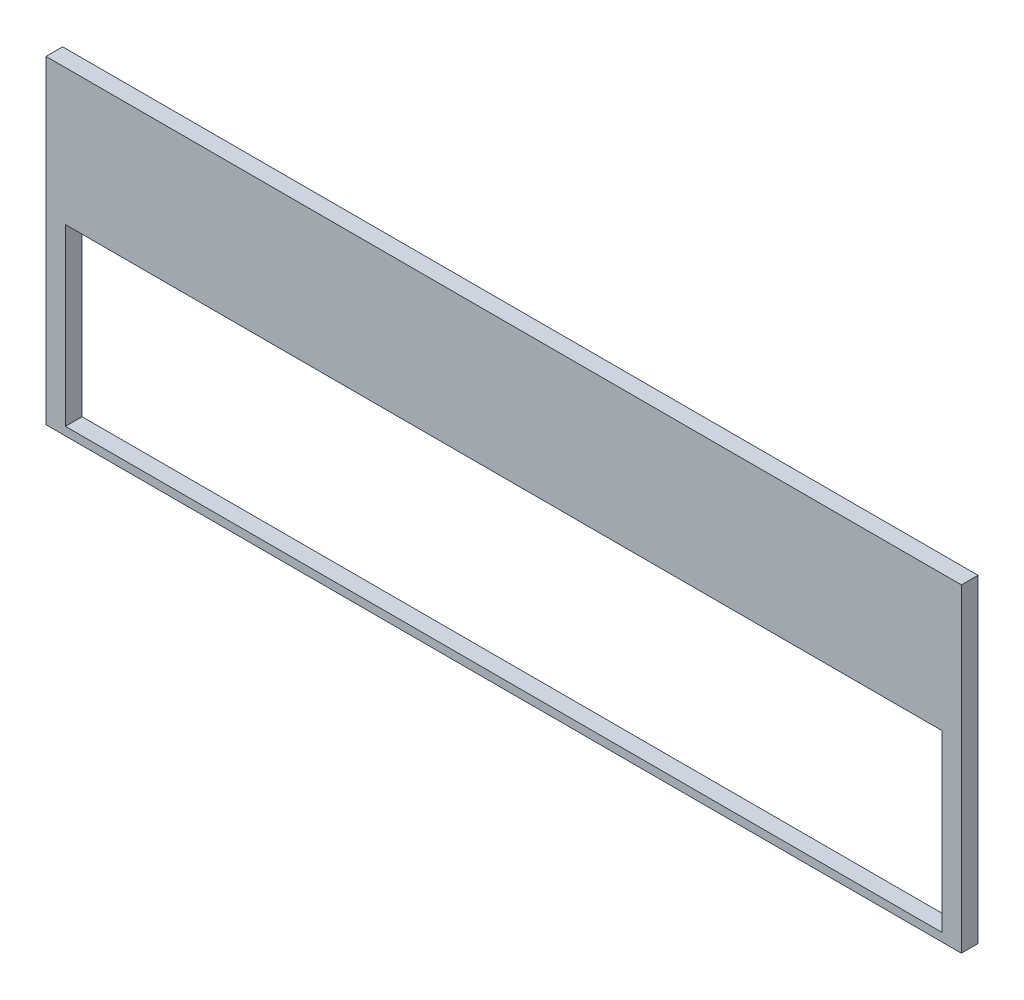
ISO-10303-21;
HEADER;
FILE_DESCRIPTION(('STEP AP214'),'2;1');
FILE_NAME('part.step','',(''),(''),'','','');
FILE_SCHEMA(('AUTOMOTIVE_DESIGN { 1 0 10303 214 1 1 1 1 }'));
ENDSEC;
DATA;
#1=APPLICATION_CONTEXT('core data for automotive mechanical design processes');
#2=APPLICATION_PROTOCOL_DEFINITION('international standard','automotive_design',2000,#1);
#3=PRODUCT_CONTEXT('',#1,'mechanical');
#4=PRODUCT('Part','Part','',(#3));
#5=PRODUCT_RELATED_PRODUCT_CATEGORY('part','',(#4));
#6=PRODUCT_DEFINITION_FORMATION('','',#4);
#7=PRODUCT_DEFINITION_CONTEXT('part definition',#1,'design');
#8=PRODUCT_DEFINITION('design','',#6,#7);
#9=PRODUCT_DEFINITION_SHAPE('','',#8);
#10=(LENGTH_UNIT() NAMED_UNIT(*) SI_UNIT(.MILLI.,.METRE.));
#11=(NAMED_UNIT(*) PLANE_ANGLE_UNIT() SI_UNIT($,.RADIAN.));
#12=(NAMED_UNIT(*) SI_UNIT($,.STERADIAN.) SOLID_ANGLE_UNIT());
#13=UNCERTAINTY_MEASURE_WITH_UNIT(LENGTH_MEASURE(1.E-05),#10,'distance_accuracy_value','');
#14=(GEOMETRIC_REPRESENTATION_CONTEXT(3) GLOBAL_UNCERTAINTY_ASSIGNED_CONTEXT((#13)) GLOBAL_UNIT_ASSIGNED_CONTEXT((#10,
#11,#12)) REPRESENTATION_CONTEXT('',''));
#15=CARTESIAN_POINT('',(0.,0.,0.));
#16=DIRECTION('',(0.,0.,1.));
#17=DIRECTION('',(1.,0.,0.));
#18=AXIS2_PLACEMENT_3D('',#15,#16,#17);
#19=CARTESIAN_POINT('',(-165.,-57.5,6.));
#20=DIRECTION('',(1.,0.,0.));
#21=DIRECTION('',(0.,0.,-1.));
#22=AXIS2_PLACEMENT_3D('',#19,#20,#21);
#23=PLANE('',#22);
#24=DIRECTION('',(0.,-1.,0.));
#25=VECTOR('',#24,1.);
#26=CARTESIAN_POINT('',(-165.,-57.5,0.));
#27=LINE('',#26,#25);
#28=CARTESIAN_POINT('',(-165.,57.5,0.));
#29=VERTEX_POINT('',#28);
#30=CARTESIAN_POINT('',(-165.,-57.5,0.));
#31=VERTEX_POINT('',#30);
#32=EDGE_CURVE('E130',#29,#31,#27,.T.);
#33=ORIENTED_EDGE('',*,*,#32,.T.);
#34=DIRECTION('',(0.,0.,-1.));
#35=VECTOR('',#34,1.);
#36=CARTESIAN_POINT('',(-165.,-57.5,6.));
#37=LINE('',#36,#35);
#38=CARTESIAN_POINT('',(-165.,-57.5,6.));
#39=VERTEX_POINT('',#38);
#40=EDGE_CURVE('E11',#39,#31,#37,.T.);
#41=ORIENTED_EDGE('',*,*,#40,.F.);
#42=DIRECTION('',(0.,-1.,0.));
#43=VECTOR('',#42,1.);
#44=CARTESIAN_POINT('',(-165.,-57.5,6.));
#45=LINE('',#44,#43);
#46=CARTESIAN_POINT('',(-165.,57.5,6.));
#47=VERTEX_POINT('',#46);
#48=EDGE_CURVE('E134',#47,#39,#45,.T.);
#49=ORIENTED_EDGE('',*,*,#48,.F.);
#50=DIRECTION('',(0.,0.,-1.));
#51=VECTOR('',#50,1.);
#52=CARTESIAN_POINT('',(-165.,57.5,6.));
#53=LINE('',#52,#51);
#54=EDGE_CURVE('E144',#47,#29,#53,.T.);
#55=ORIENTED_EDGE('',*,*,#54,.T.);
#56=EDGE_LOOP('',(#33,#41,#49,#55));
#57=FACE_BOUND('',#56,.T.);
#58=ADVANCED_FACE('F33',(#57),#23,.F.);
#59=CARTESIAN_POINT('',(165.,-57.5,6.));
#60=DIRECTION('',(0.,1.,0.));
#61=DIRECTION('',(-1.,0.,0.));
#62=AXIS2_PLACEMENT_3D('',#59,#60,#61);
#63=PLANE('',#62);
#64=DIRECTION('',(1.,0.,0.));
#65=VECTOR('',#64,1.);
#66=CARTESIAN_POINT('',(165.,-57.5,0.));
#67=LINE('',#66,#65);
#68=CARTESIAN_POINT('',(165.,-57.5,0.));
#69=VERTEX_POINT('',#68);
#70=EDGE_CURVE('E147',#31,#69,#67,.T.);
#71=ORIENTED_EDGE('',*,*,#70,.T.);
#72=DIRECTION('',(0.,0.,-1.));
#73=VECTOR('',#72,1.);
#74=CARTESIAN_POINT('',(165.,-57.5,6.));
#75=LINE('',#74,#73);
#76=CARTESIAN_POINT('',(165.,-57.5,6.));
#77=VERTEX_POINT('',#76);
#78=EDGE_CURVE('E40',#77,#69,#75,.T.);
#79=ORIENTED_EDGE('',*,*,#78,.F.);
#80=DIRECTION('',(1.,0.,0.));
#81=VECTOR('',#80,1.);
#82=CARTESIAN_POINT('',(165.,-57.5,6.));
#83=LINE('',#82,#81);
#84=EDGE_CURVE('E137',#39,#77,#83,.T.);
#85=ORIENTED_EDGE('',*,*,#84,.F.);
#86=ORIENTED_EDGE('',*,*,#40,.T.);
#87=EDGE_LOOP('',(#71,#79,#85,#86));
#88=FACE_BOUND('',#87,.T.);
#89=ADVANCED_FACE('F175',(#88),#63,.F.);
#90=CARTESIAN_POINT('',(165.,-57.5,6.));
#91=DIRECTION('',(-1.,0.,0.));
#92=DIRECTION('',(0.,0.,1.));
#93=AXIS2_PLACEMENT_3D('',#90,#91,#92);
#94=PLANE('',#93);
#95=DIRECTION('',(0.,1.,0.));
#96=VECTOR('',#95,1.);
#97=CARTESIAN_POINT('',(165.,-57.5,0.));
#98=LINE('',#97,#96);
#99=CARTESIAN_POINT('',(165.,57.5,0.));
#100=VERTEX_POINT('',#99);
#101=EDGE_CURVE('E149',#69,#100,#98,.T.);
#102=ORIENTED_EDGE('',*,*,#101,.T.);
#103=DIRECTION('',(0.,0.,-1.));
#104=VECTOR('',#103,1.);
#105=CARTESIAN_POINT('',(165.,57.5,6.));
#106=LINE('',#105,#104);
#107=CARTESIAN_POINT('',(165.,57.5,6.));
#108=VERTEX_POINT('',#107);
#109=EDGE_CURVE('E154',#108,#100,#106,.T.);
#110=ORIENTED_EDGE('',*,*,#109,.F.);
#111=DIRECTION('',(0.,1.,0.));
#112=VECTOR('',#111,1.);
#113=CARTESIAN_POINT('',(165.,-57.5,6.));
#114=LINE('',#113,#112);
#115=EDGE_CURVE('E140',#77,#108,#114,.T.);
#116=ORIENTED_EDGE('',*,*,#115,.F.);
#117=ORIENTED_EDGE('',*,*,#78,.T.);
#118=EDGE_LOOP('',(#102,#110,#116,#117));
#119=FACE_BOUND('',#118,.T.);
#120=ADVANCED_FACE('F161',(#119),#94,.F.);
#121=CARTESIAN_POINT('',(165.,57.5,6.));
#122=DIRECTION('',(0.,-1.,0.));
#123=DIRECTION('',(1.,0.,0.));
#124=AXIS2_PLACEMENT_3D('',#121,#122,#123);
#125=PLANE('',#124);
#126=DIRECTION('',(-1.,0.,0.));
#127=VECTOR('',#126,1.);
#128=CARTESIAN_POINT('',(165.,57.5,0.));
#129=LINE('',#128,#127);
#130=EDGE_CURVE('E138',#100,#29,#129,.T.);
#131=ORIENTED_EDGE('',*,*,#130,.T.);
#132=ORIENTED_EDGE('',*,*,#54,.F.);
#133=DIRECTION('',(-1.,0.,0.));
#134=VECTOR('',#133,1.);
#135=CARTESIAN_POINT('',(165.,57.5,6.));
#136=LINE('',#135,#134);
#137=EDGE_CURVE('E142',#108,#47,#136,.T.);
#138=ORIENTED_EDGE('',*,*,#137,.F.);
#139=ORIENTED_EDGE('',*,*,#109,.T.);
#140=EDGE_LOOP('',(#131,#132,#138,#139));
#141=FACE_BOUND('',#140,.T.);
#142=ADVANCED_FACE('F170',(#141),#125,.F.);
#143=CARTESIAN_POINT('',(0.,0.,6.));
#144=DIRECTION('',(0.,0.,1.));
#145=DIRECTION('',(1.,0.,0.));
#146=AXIS2_PLACEMENT_3D('',#143,#144,#145);
#147=PLANE('',#146);
#148=DIRECTION('',(0.,-1.,0.));
#149=VECTOR('',#148,1.);
#150=CARTESIAN_POINT('',(158.,-54.5,6.));
#151=LINE('',#150,#149);
#152=CARTESIAN_POINT('',(158.,8.49999999999997,6.));
#153=VERTEX_POINT('',#152);
#154=CARTESIAN_POINT('',(158.,-54.5,6.));
#155=VERTEX_POINT('',#154);
#156=EDGE_CURVE('E99',#153,#155,#151,.T.);
#157=ORIENTED_EDGE('',*,*,#156,.T.);
#158=DIRECTION('',(-1.,0.,0.));
#159=VECTOR('',#158,1.);
#160=CARTESIAN_POINT('',(158.,-54.5,6.));
#161=LINE('',#160,#159);
#162=CARTESIAN_POINT('',(-158.,-54.5,6.));
#163=VERTEX_POINT('',#162);
#164=EDGE_CURVE('E108',#155,#163,#161,.T.);
#165=ORIENTED_EDGE('',*,*,#164,.T.);
#166=DIRECTION('',(0.,1.,0.));
#167=VECTOR('',#166,1.);
#168=CARTESIAN_POINT('',(-158.,-54.5,6.));
#169=LINE('',#168,#167);
#170=CARTESIAN_POINT('',(-158.,8.49999999999997,6.));
#171=VERTEX_POINT('',#170);
#172=EDGE_CURVE('E47',#163,#171,#169,.T.);
#173=ORIENTED_EDGE('',*,*,#172,.T.);
#174=DIRECTION('',(1.,0.,0.));
#175=VECTOR('',#174,1.);
#176=CARTESIAN_POINT('',(158.,8.49999999999997,6.));
#177=LINE('',#176,#175);
#178=EDGE_CURVE('E105',#171,#153,#177,.T.);
#179=ORIENTED_EDGE('',*,*,#178,.T.);
#180=EDGE_LOOP('',(#157,#165,#173,#179));
#181=FACE_BOUND('',#180,.T.);
#182=ORIENTED_EDGE('',*,*,#48,.T.);
#183=ORIENTED_EDGE('',*,*,#84,.T.);
#184=ORIENTED_EDGE('',*,*,#115,.T.);
#185=ORIENTED_EDGE('',*,*,#137,.T.);
#186=EDGE_LOOP('',(#182,#183,#184,#185));
#187=FACE_BOUND('',#186,.T.);
#188=ADVANCED_FACE('F112',(#181,#187),#147,.T.);
#189=CARTESIAN_POINT('',(0.,0.,0.));
#190=DIRECTION('',(0.,0.,1.));
#191=DIRECTION('',(1.,0.,0.));
#192=AXIS2_PLACEMENT_3D('',#189,#190,#191);
#193=PLANE('',#192);
#194=DIRECTION('',(-1.,0.,0.));
#195=VECTOR('',#194,1.);
#196=CARTESIAN_POINT('',(158.,-54.5,0.));
#197=LINE('',#196,#195);
#198=CARTESIAN_POINT('',(158.,-54.5,0.));
#199=VERTEX_POINT('',#198);
#200=CARTESIAN_POINT('',(-158.,-54.5,0.));
#201=VERTEX_POINT('',#200);
#202=EDGE_CURVE('E124',#199,#201,#197,.T.);
#203=ORIENTED_EDGE('',*,*,#202,.F.);
#204=DIRECTION('',(0.,-1.,0.));
#205=VECTOR('',#204,1.);
#206=CARTESIAN_POINT('',(158.,-54.5,0.));
#207=LINE('',#206,#205);
#208=CARTESIAN_POINT('',(158.,8.49999999999997,0.));
#209=VERTEX_POINT('',#208);
#210=EDGE_CURVE('E55',#209,#199,#207,.T.);
#211=ORIENTED_EDGE('',*,*,#210,.F.);
#212=DIRECTION('',(1.,0.,0.));
#213=VECTOR('',#212,1.);
#214=CARTESIAN_POINT('',(158.,8.49999999999997,0.));
#215=LINE('',#214,#213);
#216=CARTESIAN_POINT('',(-158.,8.49999999999997,0.));
#217=VERTEX_POINT('',#216);
#218=EDGE_CURVE('E115',#217,#209,#215,.T.);
#219=ORIENTED_EDGE('',*,*,#218,.F.);
#220=DIRECTION('',(0.,1.,0.));
#221=VECTOR('',#220,1.);
#222=CARTESIAN_POINT('',(-158.,-54.5,0.));
#223=LINE('',#222,#221);
#224=EDGE_CURVE('E118',#201,#217,#223,.T.);
#225=ORIENTED_EDGE('',*,*,#224,.F.);
#226=EDGE_LOOP('',(#203,#211,#219,#225));
#227=FACE_BOUND('',#226,.T.);
#228=ORIENTED_EDGE('',*,*,#32,.F.);
#229=ORIENTED_EDGE('',*,*,#130,.F.);
#230=ORIENTED_EDGE('',*,*,#101,.F.);
#231=ORIENTED_EDGE('',*,*,#70,.F.);
#232=EDGE_LOOP('',(#228,#229,#230,#231));
#233=FACE_BOUND('',#232,.T.);
#234=ADVANCED_FACE('F167',(#227,#233),#193,.F.);
#235=CARTESIAN_POINT('',(158.,-54.5,6.));
#236=DIRECTION('',(1.,0.,0.));
#237=DIRECTION('',(0.,0.,-1.));
#238=AXIS2_PLACEMENT_3D('',#235,#236,#237);
#239=PLANE('',#238);
#240=ORIENTED_EDGE('',*,*,#210,.T.);
#241=DIRECTION('',(0.,0.,-1.));
#242=VECTOR('',#241,1.);
#243=CARTESIAN_POINT('',(158.,-54.5,6.));
#244=LINE('',#243,#242);
#245=EDGE_CURVE('E95',#155,#199,#244,.T.);
#246=ORIENTED_EDGE('',*,*,#245,.F.);
#247=ORIENTED_EDGE('',*,*,#156,.F.);
#248=DIRECTION('',(0.,0.,-1.));
#249=VECTOR('',#248,1.);
#250=CARTESIAN_POINT('',(158.,8.49999999999997,6.));
#251=LINE('',#250,#249);
#252=EDGE_CURVE('E128',#153,#209,#251,.T.);
#253=ORIENTED_EDGE('',*,*,#252,.T.);
#254=EDGE_LOOP('',(#240,#246,#247,#253));
#255=FACE_BOUND('',#254,.T.);
#256=ADVANCED_FACE('F97',(#255),#239,.F.);
#257=CARTESIAN_POINT('',(158.,8.49999999999997,6.));
#258=DIRECTION('',(0.,1.,0.));
#259=DIRECTION('',(0.,0.,1.));
#260=AXIS2_PLACEMENT_3D('',#257,#258,#259);
#261=PLANE('',#260);
#262=ORIENTED_EDGE('',*,*,#218,.T.);
#263=ORIENTED_EDGE('',*,*,#252,.F.);
#264=ORIENTED_EDGE('',*,*,#178,.F.);
#265=DIRECTION('',(0.,0.,-1.));
#266=VECTOR('',#265,1.);
#267=CARTESIAN_POINT('',(-158.,8.49999999999997,6.));
#268=LINE('',#267,#266);
#269=EDGE_CURVE('E131',#171,#217,#268,.T.);
#270=ORIENTED_EDGE('',*,*,#269,.T.);
#271=EDGE_LOOP('',(#262,#263,#264,#270));
#272=FACE_BOUND('',#271,.T.);
#273=ADVANCED_FACE('F192',(#272),#261,.F.);
#274=CARTESIAN_POINT('',(-158.,-54.5,6.));
#275=DIRECTION('',(-1.,0.,0.));
#276=DIRECTION('',(0.,0.,1.));
#277=AXIS2_PLACEMENT_3D('',#274,#275,#276);
#278=PLANE('',#277);
#279=ORIENTED_EDGE('',*,*,#224,.T.);
#280=ORIENTED_EDGE('',*,*,#269,.F.);
#281=ORIENTED_EDGE('',*,*,#172,.F.);
#282=DIRECTION('',(0.,0.,-1.));
#283=VECTOR('',#282,1.);
#284=CARTESIAN_POINT('',(-158.,-54.5,6.));
#285=LINE('',#284,#283);
#286=EDGE_CURVE('E104',#163,#201,#285,.T.);
#287=ORIENTED_EDGE('',*,*,#286,.T.);
#288=EDGE_LOOP('',(#279,#280,#281,#287));
#289=FACE_BOUND('',#288,.T.);
#290=ADVANCED_FACE('F195',(#289),#278,.F.);
#291=CARTESIAN_POINT('',(158.,-54.5,6.));
#292=DIRECTION('',(0.,-1.,0.));
#293=DIRECTION('',(0.,0.,-1.));
#294=AXIS2_PLACEMENT_3D('',#291,#292,#293);
#295=PLANE('',#294);
#296=ORIENTED_EDGE('',*,*,#202,.T.);
#297=ORIENTED_EDGE('',*,*,#286,.F.);
#298=ORIENTED_EDGE('',*,*,#164,.F.);
#299=ORIENTED_EDGE('',*,*,#245,.T.);
#300=EDGE_LOOP('',(#296,#297,#298,#299));
#301=FACE_BOUND('',#300,.T.);
#302=ADVANCED_FACE('F109',(#301),#295,.F.);
#303=CLOSED_SHELL('',(#58,#89,#120,#142,#188,#234,#256,#273,#290,#302));
#304=MANIFOLD_SOLID_BREP('B2',#303);
#305=ADVANCED_BREP_SHAPE_REPRESENTATION('',(#18,#304),#14);
#306=SHAPE_DEFINITION_REPRESENTATION(#9,#305);
ENDSEC;
END-ISO-10303-21;
